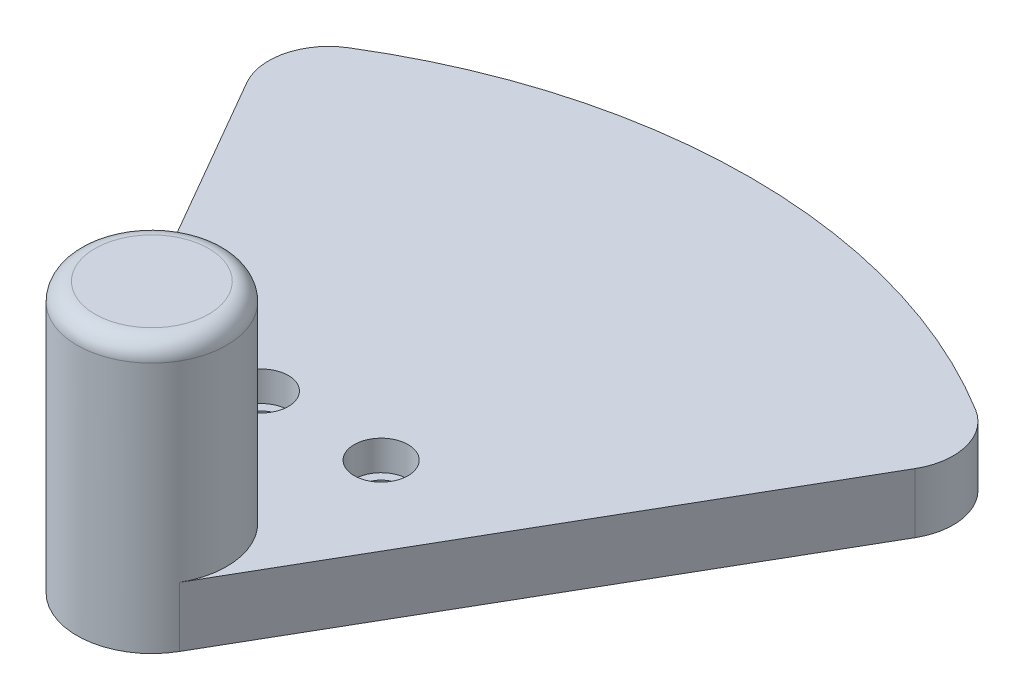
ISO-10303-21;
HEADER;
FILE_DESCRIPTION(('STEP AP214'),'2;1');
FILE_NAME('part.step','',(''),(''),'','','');
FILE_SCHEMA(('AUTOMOTIVE_DESIGN { 1 0 10303 214 1 1 1 1 }'));
ENDSEC;
DATA;
#1=APPLICATION_CONTEXT('core data for automotive mechanical design processes');
#2=APPLICATION_PROTOCOL_DEFINITION('international standard','automotive_design',2000,#1);
#3=PRODUCT_CONTEXT('',#1,'mechanical');
#4=PRODUCT('Part','Part','',(#3));
#5=PRODUCT_RELATED_PRODUCT_CATEGORY('part','',(#4));
#6=PRODUCT_DEFINITION_FORMATION('','',#4);
#7=PRODUCT_DEFINITION_CONTEXT('part definition',#1,'design');
#8=PRODUCT_DEFINITION('design','',#6,#7);
#9=PRODUCT_DEFINITION_SHAPE('','',#8);
#10=(LENGTH_UNIT() NAMED_UNIT(*) SI_UNIT(.MILLI.,.METRE.));
#11=(NAMED_UNIT(*) PLANE_ANGLE_UNIT() SI_UNIT($,.RADIAN.));
#12=(NAMED_UNIT(*) SI_UNIT($,.STERADIAN.) SOLID_ANGLE_UNIT());
#13=UNCERTAINTY_MEASURE_WITH_UNIT(LENGTH_MEASURE(1.E-05),#10,'distance_accuracy_value','');
#14=(GEOMETRIC_REPRESENTATION_CONTEXT(3) GLOBAL_UNCERTAINTY_ASSIGNED_CONTEXT((#13)) GLOBAL_UNIT_ASSIGNED_CONTEXT((#10,
#11,#12)) REPRESENTATION_CONTEXT('',''));
#15=CARTESIAN_POINT('',(0.,0.,0.));
#16=DIRECTION('',(0.,0.,1.));
#17=DIRECTION('',(1.,0.,0.));
#18=AXIS2_PLACEMENT_3D('',#15,#16,#17);
#19=CARTESIAN_POINT('',(47.1476990480774,10.,-76.6622102112372));
#20=DIRECTION('',(0.,-1.,0.));
#21=DIRECTION('',(0.,0.,-1.));
#22=AXIS2_PLACEMENT_3D('',#19,#20,#21);
#23=CYLINDRICAL_SURFACE('',#22,10.);
#24=CARTESIAN_POINT('',(47.1476990480774,0.,-76.6622102112372));
#25=DIRECTION('',(0.,1.,0.));
#26=DIRECTION('',(0.,0.,1.));
#27=AXIS2_PLACEMENT_3D('',#24,#25,#26);
#28=CIRCLE('',#27,10.);
#29=CARTESIAN_POINT('',(55.8079530859218,0.,-71.6622102112372));
#30=VERTEX_POINT('',#29);
#31=CARTESIAN_POINT('',(52.3863322756415,0.,-85.1802335680414));
#32=VERTEX_POINT('',#31);
#33=EDGE_CURVE('E123',#30,#32,#28,.T.);
#34=ORIENTED_EDGE('',*,*,#33,.T.);
#35=DIRECTION('',(0.,-1.,0.));
#36=VECTOR('',#35,1.);
#37=CARTESIAN_POINT('',(52.3863322756415,10.,-85.1802335680414));
#38=LINE('',#37,#36);
#39=CARTESIAN_POINT('',(52.3863322756415,10.,-85.1802335680414));
#40=VERTEX_POINT('',#39);
#41=EDGE_CURVE('E140',#40,#32,#38,.T.);
#42=ORIENTED_EDGE('',*,*,#41,.F.);
#43=CARTESIAN_POINT('',(47.1476990480774,10.,-76.6622102112372));
#44=DIRECTION('',(0.,1.,0.));
#45=DIRECTION('',(0.,0.,1.));
#46=AXIS2_PLACEMENT_3D('',#43,#44,#45);
#47=CIRCLE('',#46,10.);
#48=CARTESIAN_POINT('',(55.8079530859218,10.,-71.6622102112372));
#49=VERTEX_POINT('',#48);
#50=EDGE_CURVE('E134',#49,#40,#47,.T.);
#51=ORIENTED_EDGE('',*,*,#50,.F.);
#52=DIRECTION('',(0.,-1.,0.));
#53=VECTOR('',#52,1.);
#54=CARTESIAN_POINT('',(55.8079530859218,10.,-71.6622102112372));
#55=LINE('',#54,#53);
#56=EDGE_CURVE('E119',#49,#30,#55,.T.);
#57=ORIENTED_EDGE('',*,*,#56,.T.);
#58=EDGE_LOOP('',(#34,#42,#51,#57));
#59=FACE_BOUND('',#58,.T.);
#60=ADVANCED_FACE('F34',(#59),#23,.T.);
#61=CARTESIAN_POINT('',(0.,10.,0.));
#62=DIRECTION('',(0.,-1.,0.));
#63=DIRECTION('',(0.,0.,-1.));
#64=AXIS2_PLACEMENT_3D('',#61,#62,#63);
#65=CYLINDRICAL_SURFACE('',#64,100.);
#66=CARTESIAN_POINT('',(0.,0.,0.));
#67=DIRECTION('',(0.,1.,0.));
#68=DIRECTION('',(0.,0.,1.));
#69=AXIS2_PLACEMENT_3D('',#66,#67,#68);
#70=CIRCLE('',#69,100.);
#71=CARTESIAN_POINT('',(-52.3863322756415,0.,-85.1802335680413));
#72=VERTEX_POINT('',#71);
#73=EDGE_CURVE('E126',#32,#72,#70,.T.);
#74=ORIENTED_EDGE('',*,*,#73,.T.);
#75=DIRECTION('',(0.,-1.,0.));
#76=VECTOR('',#75,1.);
#77=CARTESIAN_POINT('',(-52.3863322756415,10.,-85.1802335680413));
#78=LINE('',#77,#76);
#79=CARTESIAN_POINT('',(-52.3863322756415,10.,-85.1802335680413));
#80=VERTEX_POINT('',#79);
#81=EDGE_CURVE('E113',#80,#72,#78,.T.);
#82=ORIENTED_EDGE('',*,*,#81,.F.);
#83=CARTESIAN_POINT('',(0.,10.,0.));
#84=DIRECTION('',(0.,1.,0.));
#85=DIRECTION('',(0.,0.,1.));
#86=AXIS2_PLACEMENT_3D('',#83,#84,#85);
#87=CIRCLE('',#86,100.);
#88=EDGE_CURVE('E91',#40,#80,#87,.T.);
#89=ORIENTED_EDGE('',*,*,#88,.F.);
#90=ORIENTED_EDGE('',*,*,#41,.T.);
#91=EDGE_LOOP('',(#74,#82,#89,#90));
#92=FACE_BOUND('',#91,.T.);
#93=ADVANCED_FACE('F163',(#92),#65,.T.);
#94=CARTESIAN_POINT('',(-47.1476990480774,10.,-76.6622102112372));
#95=DIRECTION('',(0.,-1.,0.));
#96=DIRECTION('',(0.,0.,-1.));
#97=AXIS2_PLACEMENT_3D('',#94,#95,#96);
#98=CYLINDRICAL_SURFACE('',#97,10.);
#99=CARTESIAN_POINT('',(-47.1476990480774,0.,-76.6622102112372));
#100=DIRECTION('',(0.,1.,0.));
#101=DIRECTION('',(0.,0.,-1.));
#102=AXIS2_PLACEMENT_3D('',#99,#100,#101);
#103=CIRCLE('',#102,10.);
#104=CARTESIAN_POINT('',(-55.8079530859218,0.,-71.6622102112372));
#105=VERTEX_POINT('',#104);
#106=EDGE_CURVE('E110',#72,#105,#103,.T.);
#107=ORIENTED_EDGE('',*,*,#106,.T.);
#108=DIRECTION('',(0.,-1.,0.));
#109=VECTOR('',#108,1.);
#110=CARTESIAN_POINT('',(-55.8079530859218,10.,-71.6622102112372));
#111=LINE('',#110,#109);
#112=CARTESIAN_POINT('',(-55.8079530859218,10.,-71.6622102112372));
#113=VERTEX_POINT('',#112);
#114=EDGE_CURVE('E107',#113,#105,#111,.T.);
#115=ORIENTED_EDGE('',*,*,#114,.F.);
#116=CARTESIAN_POINT('',(-47.1476990480774,10.,-76.6622102112372));
#117=DIRECTION('',(0.,1.,0.));
#118=DIRECTION('',(0.,0.,-1.));
#119=AXIS2_PLACEMENT_3D('',#116,#117,#118);
#120=CIRCLE('',#119,10.);
#121=EDGE_CURVE('E96',#80,#113,#120,.T.);
#122=ORIENTED_EDGE('',*,*,#121,.F.);
#123=ORIENTED_EDGE('',*,*,#81,.T.);
#124=EDGE_LOOP('',(#107,#115,#122,#123));
#125=FACE_BOUND('',#124,.T.);
#126=ADVANCED_FACE('F108',(#125),#98,.T.);
#127=CARTESIAN_POINT('',(-10.8253175473055,10.,6.24999999999998));
#128=DIRECTION('',(0.86602540378444,0.,-0.499999999999998));
#129=DIRECTION('',(-0.499999999999998,0.,-0.86602540378444));
#130=AXIS2_PLACEMENT_3D('',#127,#128,#129);
#131=PLANE('',#130);
#132=DIRECTION('',(0.499999999999998,0.,0.86602540378444));
#133=VECTOR('',#132,1.);
#134=CARTESIAN_POINT('',(-10.8253175473055,0.,6.24999999999998));
#135=LINE('',#134,#133);
#136=CARTESIAN_POINT('',(-10.8253175473055,0.,6.24999999999997));
#137=VERTEX_POINT('',#136);
#138=EDGE_CURVE('E130',#105,#137,#135,.T.);
#139=ORIENTED_EDGE('',*,*,#138,.T.);
#140=DIRECTION('',(0.,-1.,0.));
#141=VECTOR('',#140,1.);
#142=CARTESIAN_POINT('',(-10.8253175473055,10.,6.24999999999997));
#143=LINE('',#142,#141);
#144=CARTESIAN_POINT('',(-10.8253175473055,10.,6.24999999999997));
#145=VERTEX_POINT('',#144);
#146=EDGE_CURVE('E114',#145,#137,#143,.T.);
#147=ORIENTED_EDGE('',*,*,#146,.F.);
#148=DIRECTION('',(0.499999999999998,0.,0.86602540378444));
#149=VECTOR('',#148,1.);
#150=CARTESIAN_POINT('',(-10.8253175473055,10.,6.24999999999998));
#151=LINE('',#150,#149);
#152=EDGE_CURVE('E101',#113,#145,#151,.T.);
#153=ORIENTED_EDGE('',*,*,#152,.F.);
#154=ORIENTED_EDGE('',*,*,#114,.T.);
#155=EDGE_LOOP('',(#139,#147,#153,#154));
#156=FACE_BOUND('',#155,.T.);
#157=ADVANCED_FACE('F116',(#156),#131,.F.);
#158=CARTESIAN_POINT('',(0.,10.,0.));
#159=DIRECTION('',(0.,-1.,0.));
#160=DIRECTION('',(0.,0.,-1.));
#161=AXIS2_PLACEMENT_3D('',#158,#159,#160);
#162=CYLINDRICAL_SURFACE('',#161,12.5);
#163=CARTESIAN_POINT('',(0.,42.,0.));
#164=DIRECTION('',(0.,1.,0.));
#165=DIRECTION('',(0.,0.,1.));
#166=AXIS2_PLACEMENT_3D('',#163,#164,#165);
#167=CIRCLE('',#166,12.5);
#168=CARTESIAN_POINT('',(0.,42.,12.5));
#169=VERTEX_POINT('',#168);
#170=EDGE_CURVE('E11',#169,#169,#167,.F.);
#171=ORIENTED_EDGE('',*,*,#170,.T.);
#172=EDGE_LOOP('',(#171));
#173=FACE_BOUND('',#172,.T.);
#174=CARTESIAN_POINT('',(0.,0.,0.));
#175=DIRECTION('',(0.,1.,0.));
#176=DIRECTION('',(0.,0.,1.));
#177=AXIS2_PLACEMENT_3D('',#174,#175,#176);
#178=CIRCLE('',#177,12.5);
#179=CARTESIAN_POINT('',(10.8253175473055,0.,6.24999999999998));
#180=VERTEX_POINT('',#179);
#181=EDGE_CURVE('E76',#137,#180,#178,.T.);
#182=ORIENTED_EDGE('',*,*,#181,.T.);
#183=DIRECTION('',(0.,-1.,0.));
#184=VECTOR('',#183,1.);
#185=CARTESIAN_POINT('',(10.8253175473055,10.,6.24999999999998));
#186=LINE('',#185,#184);
#187=CARTESIAN_POINT('',(10.8253175473055,10.,6.24999999999998));
#188=VERTEX_POINT('',#187);
#189=EDGE_CURVE('E136',#188,#180,#186,.T.);
#190=ORIENTED_EDGE('',*,*,#189,.F.);
#191=CARTESIAN_POINT('',(0.,10.,0.));
#192=DIRECTION('',(0.,1.,0.));
#193=DIRECTION('',(0.,0.,1.));
#194=AXIS2_PLACEMENT_3D('',#191,#192,#193);
#195=CIRCLE('',#194,12.5);
#196=EDGE_CURVE('E218',#188,#145,#195,.T.);
#197=ORIENTED_EDGE('',*,*,#196,.T.);
#198=ORIENTED_EDGE('',*,*,#146,.T.);
#199=EDGE_LOOP('',(#182,#190,#197,#198));
#200=FACE_BOUND('',#199,.T.);
#201=ADVANCED_FACE('F174',(#173,#200),#162,.T.);
#202=CARTESIAN_POINT('',(10.8253175473055,10.,6.24999999999998));
#203=DIRECTION('',(-0.86602540378444,0.,-0.499999999999998));
#204=DIRECTION('',(-0.499999999999998,0.,0.86602540378444));
#205=AXIS2_PLACEMENT_3D('',#202,#203,#204);
#206=PLANE('',#205);
#207=DIRECTION('',(0.499999999999998,0.,-0.86602540378444));
#208=VECTOR('',#207,1.);
#209=CARTESIAN_POINT('',(10.8253175473055,0.,6.24999999999998));
#210=LINE('',#209,#208);
#211=EDGE_CURVE('E82',#180,#30,#210,.T.);
#212=ORIENTED_EDGE('',*,*,#211,.T.);
#213=ORIENTED_EDGE('',*,*,#56,.F.);
#214=DIRECTION('',(0.499999999999998,0.,-0.86602540378444));
#215=VECTOR('',#214,1.);
#216=CARTESIAN_POINT('',(10.8253175473055,10.,6.24999999999998));
#217=LINE('',#216,#215);
#218=EDGE_CURVE('E51',#188,#49,#217,.T.);
#219=ORIENTED_EDGE('',*,*,#218,.F.);
#220=ORIENTED_EDGE('',*,*,#189,.T.);
#221=EDGE_LOOP('',(#212,#213,#219,#220));
#222=FACE_BOUND('',#221,.T.);
#223=ADVANCED_FACE('F177',(#222),#206,.F.);
#224=CARTESIAN_POINT('',(47.1476990480774,10.,-76.6622102112372));
#225=DIRECTION('',(0.,1.,0.));
#226=DIRECTION('',(0.,0.,1.));
#227=AXIS2_PLACEMENT_3D('',#224,#225,#226);
#228=PLANE('',#227);
#229=ORIENTED_EDGE('',*,*,#196,.F.);
#230=ORIENTED_EDGE('',*,*,#218,.T.);
#231=ORIENTED_EDGE('',*,*,#50,.T.);
#232=ORIENTED_EDGE('',*,*,#88,.T.);
#233=ORIENTED_EDGE('',*,*,#121,.T.);
#234=ORIENTED_EDGE('',*,*,#152,.T.);
#235=EDGE_LOOP('',(#229,#230,#231,#232,#233,#234));
#236=FACE_BOUND('',#235,.T.);
#237=CARTESIAN_POINT('',(10.,10.,-28.2842712474619));
#238=DIRECTION('',(0.,1.,0.));
#239=DIRECTION('',(0.,0.,1.));
#240=AXIS2_PLACEMENT_3D('',#237,#238,#239);
#241=CIRCLE('',#240,4.5);
#242=CARTESIAN_POINT('',(10.,10.,-23.7842712474619));
#243=VERTEX_POINT('',#242);
#244=EDGE_CURVE('E224',#243,#243,#241,.T.);
#245=ORIENTED_EDGE('',*,*,#244,.F.);
#246=EDGE_LOOP('',(#245));
#247=FACE_BOUND('',#246,.T.);
#248=CARTESIAN_POINT('',(-10.,10.,-28.2842712474619));
#249=DIRECTION('',(0.,1.,0.));
#250=DIRECTION('',(0.,0.,-1.));
#251=AXIS2_PLACEMENT_3D('',#248,#249,#250);
#252=CIRCLE('',#251,4.5);
#253=CARTESIAN_POINT('',(-10.,10.,-32.7842712474619));
#254=VERTEX_POINT('',#253);
#255=EDGE_CURVE('E148',#254,#254,#252,.T.);
#256=ORIENTED_EDGE('',*,*,#255,.F.);
#257=EDGE_LOOP('',(#256));
#258=FACE_BOUND('',#257,.T.);
#259=ADVANCED_FACE('F98',(#236,#247,#258),#228,.T.);
#260=CARTESIAN_POINT('',(47.1476990480774,0.,-76.6622102112372));
#261=DIRECTION('',(0.,1.,0.));
#262=DIRECTION('',(0.,0.,1.));
#263=AXIS2_PLACEMENT_3D('',#260,#261,#262);
#264=PLANE('',#263);
#265=CARTESIAN_POINT('',(10.,0.,-28.2842712474619));
#266=DIRECTION('',(0.,1.,0.));
#267=DIRECTION('',(0.,0.,1.));
#268=AXIS2_PLACEMENT_3D('',#265,#266,#267);
#269=CIRCLE('',#268,3.);
#270=CARTESIAN_POINT('',(10.,0.,-25.2842712474619));
#271=VERTEX_POINT('',#270);
#272=EDGE_CURVE('E146',#271,#271,#269,.T.);
#273=ORIENTED_EDGE('',*,*,#272,.T.);
#274=EDGE_LOOP('',(#273));
#275=FACE_BOUND('',#274,.T.);
#276=CARTESIAN_POINT('',(-10.,0.,-28.2842712474619));
#277=DIRECTION('',(0.,1.,0.));
#278=DIRECTION('',(0.,0.,-1.));
#279=AXIS2_PLACEMENT_3D('',#276,#277,#278);
#280=CIRCLE('',#279,3.);
#281=CARTESIAN_POINT('',(-10.,0.,-31.2842712474619));
#282=VERTEX_POINT('',#281);
#283=EDGE_CURVE('E215',#282,#282,#280,.T.);
#284=ORIENTED_EDGE('',*,*,#283,.T.);
#285=EDGE_LOOP('',(#284));
#286=FACE_BOUND('',#285,.T.);
#287=ORIENTED_EDGE('',*,*,#33,.F.);
#288=ORIENTED_EDGE('',*,*,#211,.F.);
#289=ORIENTED_EDGE('',*,*,#181,.F.);
#290=ORIENTED_EDGE('',*,*,#138,.F.);
#291=ORIENTED_EDGE('',*,*,#106,.F.);
#292=ORIENTED_EDGE('',*,*,#73,.F.);
#293=EDGE_LOOP('',(#287,#288,#289,#290,#291,#292));
#294=FACE_BOUND('',#293,.T.);
#295=ADVANCED_FACE('F181',(#275,#286,#294),#264,.F.);
#296=CARTESIAN_POINT('',(-10.,5.,-28.2842712474619));
#297=DIRECTION('',(0.,1.,0.));
#298=DIRECTION('',(0.,0.,1.));
#299=AXIS2_PLACEMENT_3D('',#296,#297,#298);
#300=CYLINDRICAL_SURFACE('',#299,4.5);
#301=CARTESIAN_POINT('',(-10.,5.,-28.2842712474619));
#302=DIRECTION('',(0.,1.,0.));
#303=DIRECTION('',(0.,0.,-1.));
#304=AXIS2_PLACEMENT_3D('',#301,#302,#303);
#305=CIRCLE('',#304,4.5);
#306=CARTESIAN_POINT('',(-10.,5.,-32.7842712474619));
#307=VERTEX_POINT('',#306);
#308=EDGE_CURVE('E227',#307,#307,#305,.T.);
#309=ORIENTED_EDGE('',*,*,#308,.F.);
#310=EDGE_LOOP('',(#309));
#311=FACE_BOUND('',#310,.T.);
#312=ORIENTED_EDGE('',*,*,#255,.T.);
#313=EDGE_LOOP('',(#312));
#314=FACE_BOUND('',#313,.T.);
#315=ADVANCED_FACE('F184',(#311,#314),#300,.F.);
#316=CARTESIAN_POINT('',(-10.,5.,-28.2842712474619));
#317=DIRECTION('',(0.,-1.,0.));
#318=DIRECTION('',(0.,0.,-1.));
#319=AXIS2_PLACEMENT_3D('',#316,#317,#318);
#320=PLANE('',#319);
#321=CARTESIAN_POINT('',(-10.,5.,-28.2842712474619));
#322=DIRECTION('',(0.,-1.,0.));
#323=DIRECTION('',(0.,0.,-1.));
#324=AXIS2_PLACEMENT_3D('',#321,#322,#323);
#325=CIRCLE('',#324,3.);
#326=CARTESIAN_POINT('',(-10.,5.,-31.2842712474619));
#327=VERTEX_POINT('',#326);
#328=EDGE_CURVE('E145',#327,#327,#325,.T.);
#329=ORIENTED_EDGE('',*,*,#328,.T.);
#330=EDGE_LOOP('',(#329));
#331=FACE_BOUND('',#330,.T.);
#332=ORIENTED_EDGE('',*,*,#308,.T.);
#333=EDGE_LOOP('',(#332));
#334=FACE_BOUND('',#333,.T.);
#335=ADVANCED_FACE('F190',(#331,#334),#320,.F.);
#336=CARTESIAN_POINT('',(10.,5.,-28.2842712474619));
#337=DIRECTION('',(0.,1.,0.));
#338=DIRECTION('',(0.,0.,1.));
#339=AXIS2_PLACEMENT_3D('',#336,#337,#338);
#340=CYLINDRICAL_SURFACE('',#339,4.5);
#341=CARTESIAN_POINT('',(10.,5.,-28.2842712474619));
#342=DIRECTION('',(0.,1.,0.));
#343=DIRECTION('',(0.,0.,1.));
#344=AXIS2_PLACEMENT_3D('',#341,#342,#343);
#345=CIRCLE('',#344,4.5);
#346=CARTESIAN_POINT('',(10.,5.,-23.7842712474619));
#347=VERTEX_POINT('',#346);
#348=EDGE_CURVE('E127',#347,#347,#345,.T.);
#349=ORIENTED_EDGE('',*,*,#348,.F.);
#350=EDGE_LOOP('',(#349));
#351=FACE_BOUND('',#350,.T.);
#352=ORIENTED_EDGE('',*,*,#244,.T.);
#353=EDGE_LOOP('',(#352));
#354=FACE_BOUND('',#353,.T.);
#355=ADVANCED_FACE('F194',(#351,#354),#340,.F.);
#356=CARTESIAN_POINT('',(10.,5.,-28.2842712474619));
#357=DIRECTION('',(0.,1.,0.));
#358=DIRECTION('',(0.,0.,1.));
#359=AXIS2_PLACEMENT_3D('',#356,#357,#358);
#360=PLANE('',#359);
#361=CARTESIAN_POINT('',(10.,5.,-28.2842712474619));
#362=DIRECTION('',(0.,1.,0.));
#363=DIRECTION('',(0.,0.,1.));
#364=AXIS2_PLACEMENT_3D('',#361,#362,#363);
#365=CIRCLE('',#364,3.);
#366=CARTESIAN_POINT('',(10.,5.,-25.2842712474619));
#367=VERTEX_POINT('',#366);
#368=EDGE_CURVE('E142',#367,#367,#365,.T.);
#369=ORIENTED_EDGE('',*,*,#368,.F.);
#370=EDGE_LOOP('',(#369));
#371=FACE_BOUND('',#370,.T.);
#372=ORIENTED_EDGE('',*,*,#348,.T.);
#373=EDGE_LOOP('',(#372));
#374=FACE_BOUND('',#373,.T.);
#375=ADVANCED_FACE('F198',(#371,#374),#360,.T.);
#376=CARTESIAN_POINT('',(10.,0.,-28.2842712474619));
#377=DIRECTION('',(0.,1.,0.));
#378=DIRECTION('',(0.,0.,1.));
#379=AXIS2_PLACEMENT_3D('',#376,#377,#378);
#380=CYLINDRICAL_SURFACE('',#379,3.);
#381=ORIENTED_EDGE('',*,*,#368,.T.);
#382=EDGE_LOOP('',(#381));
#383=FACE_BOUND('',#382,.T.);
#384=ORIENTED_EDGE('',*,*,#272,.F.);
#385=EDGE_LOOP('',(#384));
#386=FACE_BOUND('',#385,.T.);
#387=ADVANCED_FACE('F202',(#383,#386),#380,.F.);
#388=CARTESIAN_POINT('',(-10.,0.,-28.2842712474619));
#389=DIRECTION('',(0.,1.,0.));
#390=DIRECTION('',(0.,0.,1.));
#391=AXIS2_PLACEMENT_3D('',#388,#389,#390);
#392=CYLINDRICAL_SURFACE('',#391,3.);
#393=ORIENTED_EDGE('',*,*,#283,.F.);
#394=EDGE_LOOP('',(#393));
#395=FACE_BOUND('',#394,.T.);
#396=ORIENTED_EDGE('',*,*,#328,.F.);
#397=EDGE_LOOP('',(#396));
#398=FACE_BOUND('',#397,.T.);
#399=ADVANCED_FACE('F159',(#395,#398),#392,.F.);
#400=CARTESIAN_POINT('',(0.,45.,0.));
#401=DIRECTION('',(0.,1.,0.));
#402=DIRECTION('',(0.,0.,1.));
#403=AXIS2_PLACEMENT_3D('',#400,#401,#402);
#404=PLANE('',#403);
#405=CARTESIAN_POINT('',(0.,45.,0.));
#406=DIRECTION('',(0.,1.,0.));
#407=DIRECTION('',(0.,0.,1.));
#408=AXIS2_PLACEMENT_3D('',#405,#406,#407);
#409=CIRCLE('',#408,9.5);
#410=CARTESIAN_POINT('',(0.,45.,9.5));
#411=VERTEX_POINT('',#410);
#412=EDGE_CURVE('E43',#411,#411,#409,.T.);
#413=ORIENTED_EDGE('',*,*,#412,.T.);
#414=EDGE_LOOP('',(#413));
#415=FACE_BOUND('',#414,.T.);
#416=ADVANCED_FACE('F152',(#415),#404,.T.);
#417=CARTESIAN_POINT('',(0.,42.,0.));
#418=DIRECTION('',(0.,1.,0.));
#419=DIRECTION('',(0.,0.,1.));
#420=AXIS2_PLACEMENT_3D('',#417,#418,#419);
#421=TOROIDAL_SURFACE('',#420,9.5,3.);
#422=ORIENTED_EDGE('',*,*,#170,.F.);
#423=EDGE_LOOP('',(#422));
#424=FACE_BOUND('',#423,.T.);
#425=ORIENTED_EDGE('',*,*,#412,.F.);
#426=EDGE_LOOP('',(#425));
#427=FACE_BOUND('',#426,.T.);
#428=ADVANCED_FACE('F36',(#424,#427),#421,.T.);
#429=CLOSED_SHELL('',(#60,#93,#126,#157,#201,#223,#259,#295,#315,#335,#355,#375,#387,#399,#416,#428));
#430=MANIFOLD_SOLID_BREP('B2',#429);
#431=ADVANCED_BREP_SHAPE_REPRESENTATION('',(#18,#430),#14);
#432=SHAPE_DEFINITION_REPRESENTATION(#9,#431);
ENDSEC;
END-ISO-10303-21;
